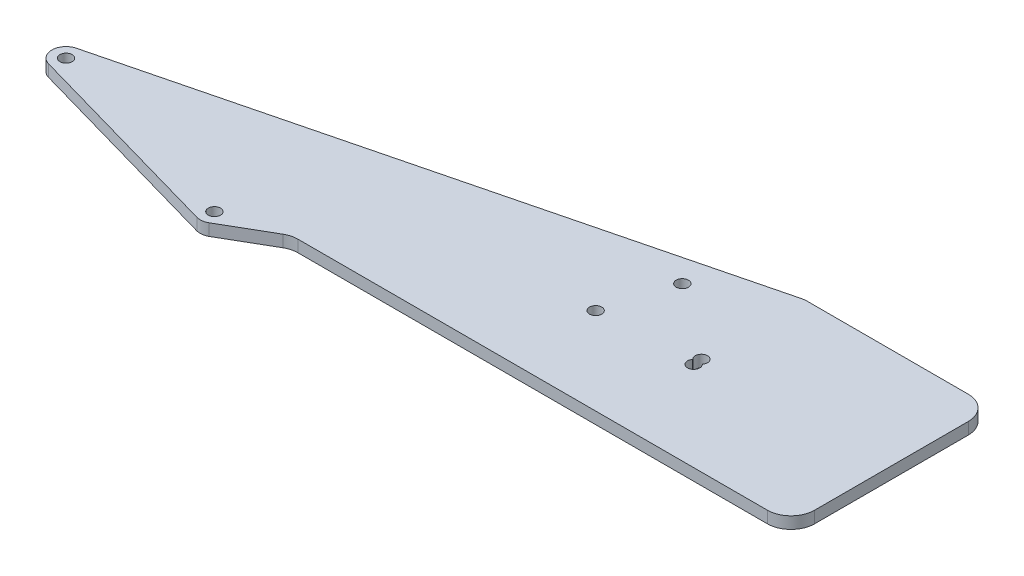
ISO-10303-21;
HEADER;
FILE_DESCRIPTION(('STEP AP214'),'2;1');
FILE_NAME('part.step','',(''),(''),'','','');
FILE_SCHEMA(('AUTOMOTIVE_DESIGN { 1 0 10303 214 1 1 1 1 }'));
ENDSEC;
DATA;
#1=APPLICATION_CONTEXT('core data for automotive mechanical design processes');
#2=APPLICATION_PROTOCOL_DEFINITION('international standard','automotive_design',2000,#1);
#3=PRODUCT_CONTEXT('',#1,'mechanical');
#4=PRODUCT('Part','Part','',(#3));
#5=PRODUCT_RELATED_PRODUCT_CATEGORY('part','',(#4));
#6=PRODUCT_DEFINITION_FORMATION('','',#4);
#7=PRODUCT_DEFINITION_CONTEXT('part definition',#1,'design');
#8=PRODUCT_DEFINITION('design','',#6,#7);
#9=PRODUCT_DEFINITION_SHAPE('','',#8);
#10=(LENGTH_UNIT() NAMED_UNIT(*) SI_UNIT(.MILLI.,.METRE.));
#11=(NAMED_UNIT(*) PLANE_ANGLE_UNIT() SI_UNIT($,.RADIAN.));
#12=(NAMED_UNIT(*) SI_UNIT($,.STERADIAN.) SOLID_ANGLE_UNIT());
#13=UNCERTAINTY_MEASURE_WITH_UNIT(LENGTH_MEASURE(1.E-05),#10,'distance_accuracy_value','');
#14=(GEOMETRIC_REPRESENTATION_CONTEXT(3) GLOBAL_UNCERTAINTY_ASSIGNED_CONTEXT((#13)) GLOBAL_UNIT_ASSIGNED_CONTEXT((#10,
#11,#12)) REPRESENTATION_CONTEXT('',''));
#15=CARTESIAN_POINT('',(0.,0.,0.));
#16=DIRECTION('',(0.,0.,1.));
#17=DIRECTION('',(1.,0.,0.));
#18=AXIS2_PLACEMENT_3D('',#15,#16,#17);
#19=CARTESIAN_POINT('',(170.96493724564,215.9,-60.2049776147186));
#20=DIRECTION('',(0.,-1.,0.));
#21=DIRECTION('',(0.,0.,-1.));
#22=AXIS2_PLACEMENT_3D('',#19,#20,#21);
#23=PLANE('',#22);
#24=DIRECTION('',(0.969793652529833,0.,-0.243926774899446));
#25=VECTOR('',#24,1.);
#26=CARTESIAN_POINT('',(57.8250270140459,215.9,-99.1719417743862));
#27=LINE('',#26,#25);
#28=CARTESIAN_POINT('',(57.8250270140459,215.9,-99.1719417743862));
#29=VERTEX_POINT('',#28);
#30=CARTESIAN_POINT('',(368.90591993318,215.9,-177.416379387129));
#31=VERTEX_POINT('',#30);
#32=EDGE_CURVE('E146',#29,#31,#27,.T.);
#33=ORIENTED_EDGE('',*,*,#32,.T.);
#34=CARTESIAN_POINT('',(372.003789974403,215.9,-165.1));
#35=DIRECTION('',(0.,-1.,0.));
#36=DIRECTION('',(0.,0.,-1.));
#37=AXIS2_PLACEMENT_3D('',#34,#35,#36);
#38=CIRCLE('',#37,12.7);
#39=CARTESIAN_POINT('',(372.003789974403,215.9,-177.8));
#40=VERTEX_POINT('',#39);
#41=EDGE_CURVE('E11',#31,#40,#38,.T.);
#42=ORIENTED_EDGE('',*,*,#41,.T.);
#43=DIRECTION('',(1.,0.,0.));
#44=VECTOR('',#43,1.);
#45=CARTESIAN_POINT('',(163.040808988288,215.9,-177.8));
#46=LINE('',#45,#44);
#47=CARTESIAN_POINT('',(458.47,215.9,-177.8));
#48=VERTEX_POINT('',#47);
#49=EDGE_CURVE('E198',#40,#48,#46,.T.);
#50=ORIENTED_EDGE('',*,*,#49,.T.);
#51=CARTESIAN_POINT('',(458.47,215.9,-165.1));
#52=DIRECTION('',(0.,-1.,0.));
#53=DIRECTION('',(0.,0.,-1.));
#54=AXIS2_PLACEMENT_3D('',#51,#52,#53);
#55=CIRCLE('',#54,12.7);
#56=CARTESIAN_POINT('',(471.17,215.9,-165.1));
#57=VERTEX_POINT('',#56);
#58=EDGE_CURVE('E248',#48,#57,#55,.T.);
#59=ORIENTED_EDGE('',*,*,#58,.T.);
#60=DIRECTION('',(0.,0.,1.));
#61=VECTOR('',#60,1.);
#62=CARTESIAN_POINT('',(471.17,215.9,-177.8));
#63=LINE('',#62,#61);
#64=CARTESIAN_POINT('',(471.17,215.9,-82.55));
#65=VERTEX_POINT('',#64);
#66=EDGE_CURVE('E200',#57,#65,#63,.T.);
#67=ORIENTED_EDGE('',*,*,#66,.T.);
#68=CARTESIAN_POINT('',(458.47,215.9,-82.55));
#69=DIRECTION('',(0.,-1.,0.));
#70=DIRECTION('',(0.,0.,-1.));
#71=AXIS2_PLACEMENT_3D('',#68,#69,#70);
#72=CIRCLE('',#71,12.7);
#73=CARTESIAN_POINT('',(458.47,215.9,-69.85));
#74=VERTEX_POINT('',#73);
#75=EDGE_CURVE('E250',#65,#74,#72,.T.);
#76=ORIENTED_EDGE('',*,*,#75,.T.);
#77=DIRECTION('',(-1.,0.,0.));
#78=VECTOR('',#77,1.);
#79=CARTESIAN_POINT('',(202.831083848814,215.9,-69.85));
#80=LINE('',#79,#78);
#81=CARTESIAN_POINT('',(206.242388341444,215.9,-69.85));
#82=VERTEX_POINT('',#81);
#83=EDGE_CURVE('E203',#74,#82,#80,.T.);
#84=ORIENTED_EDGE('',*,*,#83,.T.);
#85=CARTESIAN_POINT('',(206.242388341444,215.9,-57.15));
#86=DIRECTION('',(0.,-1.,0.));
#87=DIRECTION('',(0.,0.,-1.));
#88=AXIS2_PLACEMENT_3D('',#85,#86,#87);
#89=CIRCLE('',#88,12.7);
#90=CARTESIAN_POINT('',(199.878901935118,215.9,-68.1407252152215));
#91=VERTEX_POINT('',#90);
#92=EDGE_CURVE('E257',#82,#91,#89,.F.);
#93=ORIENTED_EDGE('',*,*,#92,.T.);
#94=DIRECTION('',(-0.865411434269409,0.,0.501061921757944));
#95=VECTOR('',#94,1.);
#96=CARTESIAN_POINT('',(174.783029089435,215.9,-53.6105424855857));
#97=LINE('',#96,#95);
#98=CARTESIAN_POINT('',(174.783029089435,215.9,-53.6105424855857));
#99=VERTEX_POINT('',#98);
#100=EDGE_CURVE('E206',#91,#99,#97,.T.);
#101=ORIENTED_EDGE('',*,*,#100,.T.);
#102=CARTESIAN_POINT('',(170.96493724564,215.9,-60.2049776147186));
#103=DIRECTION('',(0.,-1.,0.));
#104=DIRECTION('',(0.,0.,-1.));
#105=AXIS2_PLACEMENT_3D('',#102,#103,#104);
#106=CIRCLE('',#105,7.61999999999998);
#107=CARTESIAN_POINT('',(168.884811335963,215.9,-52.8743926312475));
#108=VERTEX_POINT('',#107);
#109=EDGE_CURVE('E208',#99,#108,#106,.T.);
#110=ORIENTED_EDGE('',*,*,#109,.T.);
#111=DIRECTION('',(-0.96201902670224,0.,-0.272982402844717));
#112=VECTOR('',#111,1.);
#113=CARTESIAN_POINT('',(57.603623129103,215.9,-84.4515291586379));
#114=LINE('',#113,#112);
#115=CARTESIAN_POINT('',(57.603623129103,215.9,-84.4515291586379));
#116=VERTEX_POINT('',#115);
#117=EDGE_CURVE('E149',#108,#116,#114,.T.);
#118=ORIENTED_EDGE('',*,*,#117,.T.);
#119=CARTESIAN_POINT('',(59.6837490387797,215.9,-91.7821141421089));
#120=DIRECTION('',(0.,-1.,0.));
#121=DIRECTION('',(0.,0.,1.));
#122=AXIS2_PLACEMENT_3D('',#119,#120,#121);
#123=CIRCLE('',#122,7.61999999999996);
#124=EDGE_CURVE('E143',#116,#29,#123,.T.);
#125=ORIENTED_EDGE('',*,*,#124,.T.);
#126=EDGE_LOOP('',(#33,#42,#50,#59,#67,#76,#84,#93,#101,#110,#118,#125));
#127=FACE_BOUND('',#126,.T.);
#128=CARTESIAN_POINT('',(370.810624172645,215.9,-117.899600818595));
#129=DIRECTION('',(0.,-1.,0.));
#130=DIRECTION('',(0.,0.,-1.));
#131=AXIS2_PLACEMENT_3D('',#128,#129,#130);
#132=CIRCLE('',#131,3.30200000000015);
#133=CARTESIAN_POINT('',(373.075128259812,215.9,-120.30277065013));
#134=VERTEX_POINT('',#133);
#135=CARTESIAN_POINT('',(368.235920217802,215.9,-119.966991334417));
#136=VERTEX_POINT('',#135);
#137=EDGE_CURVE('E176',#134,#136,#132,.T.);
#138=ORIENTED_EDGE('',*,*,#137,.F.);
#139=CARTESIAN_POINT('',(370.500424304969,215.9,-122.370161165953));
#140=DIRECTION('',(0.,-1.,0.));
#141=DIRECTION('',(0.,0.,-1.));
#142=AXIS2_PLACEMENT_3D('',#139,#140,#141);
#143=CIRCLE('',#142,3.30200000000015);
#144=EDGE_CURVE('E174',#136,#134,#143,.T.);
#145=ORIENTED_EDGE('',*,*,#144,.F.);
#146=EDGE_LOOP('',(#138,#145));
#147=FACE_BOUND('',#146,.T.);
#148=CARTESIAN_POINT('',(319.459191205803,215.9,-116.582508471068));
#149=DIRECTION('',(0.,-1.,0.));
#150=DIRECTION('',(0.,0.,-1.));
#151=AXIS2_PLACEMENT_3D('',#148,#149,#150);
#152=CIRCLE('',#151,3.3020000000001);
#153=CARTESIAN_POINT('',(319.459191205803,215.9,-119.884508471068));
#154=VERTEX_POINT('',#153);
#155=EDGE_CURVE('E171',#154,#154,#152,.T.);
#156=ORIENTED_EDGE('',*,*,#155,.F.);
#157=EDGE_LOOP('',(#156));
#158=FACE_BOUND('',#157,.T.);
#159=CARTESIAN_POINT('',(59.6837490387797,215.9,-91.7821141421089));
#160=DIRECTION('',(0.,-1.,0.));
#161=DIRECTION('',(0.,0.,-1.));
#162=AXIS2_PLACEMENT_3D('',#159,#160,#161);
#163=CIRCLE('',#162,3.30200000000001);
#164=CARTESIAN_POINT('',(59.6837490387797,215.9,-95.0841141421089));
#165=VERTEX_POINT('',#164);
#166=EDGE_CURVE('E186',#165,#165,#163,.T.);
#167=ORIENTED_EDGE('',*,*,#166,.F.);
#168=EDGE_LOOP('',(#167));
#169=FACE_BOUND('',#168,.T.);
#170=CARTESIAN_POINT('',(330.2,215.9,-152.4));
#171=DIRECTION('',(0.,-1.,0.));
#172=DIRECTION('',(0.,0.,-1.));
#173=AXIS2_PLACEMENT_3D('',#170,#171,#172);
#174=CIRCLE('',#173,3.30200000000004);
#175=CARTESIAN_POINT('',(330.2,215.9,-155.702));
#176=VERTEX_POINT('',#175);
#177=EDGE_CURVE('E192',#176,#176,#174,.T.);
#178=ORIENTED_EDGE('',*,*,#177,.F.);
#179=EDGE_LOOP('',(#178));
#180=FACE_BOUND('',#179,.T.);
#181=CARTESIAN_POINT('',(170.96493724564,215.9,-60.2049776147186));
#182=DIRECTION('',(0.,-1.,0.));
#183=DIRECTION('',(0.,0.,-1.));
#184=AXIS2_PLACEMENT_3D('',#181,#182,#183);
#185=CIRCLE('',#184,3.30200000000001);
#186=CARTESIAN_POINT('',(170.96493724564,215.9,-63.5069776147186));
#187=VERTEX_POINT('',#186);
#188=EDGE_CURVE('E180',#187,#187,#185,.T.);
#189=ORIENTED_EDGE('',*,*,#188,.F.);
#190=EDGE_LOOP('',(#189));
#191=FACE_BOUND('',#190,.T.);
#192=ADVANCED_FACE('F43',(#127,#147,#158,#169,#180,#191),#23,.T.);
#193=CARTESIAN_POINT('',(170.96493724564,222.25,-60.2049776147186));
#194=DIRECTION('',(0.,-1.,0.));
#195=DIRECTION('',(0.,0.,-1.));
#196=AXIS2_PLACEMENT_3D('',#193,#194,#195);
#197=PLANE('',#196);
#198=CARTESIAN_POINT('',(370.500424304969,222.25,-122.370161165953));
#199=DIRECTION('',(0.,-1.,0.));
#200=DIRECTION('',(0.,0.,-1.));
#201=AXIS2_PLACEMENT_3D('',#198,#199,#200);
#202=CIRCLE('',#201,3.30200000000015);
#203=CARTESIAN_POINT('',(368.235920217802,222.25,-119.966991334417));
#204=VERTEX_POINT('',#203);
#205=CARTESIAN_POINT('',(373.075128259812,222.25,-120.30277065013));
#206=VERTEX_POINT('',#205);
#207=EDGE_CURVE('E259',#204,#206,#202,.T.);
#208=ORIENTED_EDGE('',*,*,#207,.T.);
#209=CARTESIAN_POINT('',(370.810624172645,222.25,-117.899600818595));
#210=DIRECTION('',(0.,-1.,0.));
#211=DIRECTION('',(0.,0.,-1.));
#212=AXIS2_PLACEMENT_3D('',#209,#210,#211);
#213=CIRCLE('',#212,3.30200000000015);
#214=EDGE_CURVE('E264',#206,#204,#213,.T.);
#215=ORIENTED_EDGE('',*,*,#214,.T.);
#216=EDGE_LOOP('',(#208,#215));
#217=FACE_BOUND('',#216,.T.);
#218=CARTESIAN_POINT('',(319.459191205803,222.25,-116.582508471068));
#219=DIRECTION('',(0.,-1.,0.));
#220=DIRECTION('',(0.,0.,-1.));
#221=AXIS2_PLACEMENT_3D('',#218,#219,#220);
#222=CIRCLE('',#221,3.3020000000001);
#223=CARTESIAN_POINT('',(319.459191205803,222.25,-119.884508471068));
#224=VERTEX_POINT('',#223);
#225=EDGE_CURVE('E168',#224,#224,#222,.T.);
#226=ORIENTED_EDGE('',*,*,#225,.T.);
#227=EDGE_LOOP('',(#226));
#228=FACE_BOUND('',#227,.T.);
#229=DIRECTION('',(1.,0.,0.));
#230=VECTOR('',#229,1.);
#231=CARTESIAN_POINT('',(163.040808988288,222.25,-177.8));
#232=LINE('',#231,#230);
#233=CARTESIAN_POINT('',(372.003789974403,222.25,-177.8));
#234=VERTEX_POINT('',#233);
#235=CARTESIAN_POINT('',(458.47,222.25,-177.8));
#236=VERTEX_POINT('',#235);
#237=EDGE_CURVE('E195',#234,#236,#232,.T.);
#238=ORIENTED_EDGE('',*,*,#237,.F.);
#239=CARTESIAN_POINT('',(372.003789974403,222.25,-165.1));
#240=DIRECTION('',(0.,-1.,0.));
#241=DIRECTION('',(0.,0.,-1.));
#242=AXIS2_PLACEMENT_3D('',#239,#240,#241);
#243=CIRCLE('',#242,12.7);
#244=CARTESIAN_POINT('',(368.90591993318,222.25,-177.416379387129));
#245=VERTEX_POINT('',#244);
#246=EDGE_CURVE('E65',#234,#245,#243,.F.);
#247=ORIENTED_EDGE('',*,*,#246,.T.);
#248=DIRECTION('',(0.969793652529833,0.,-0.243926774899446));
#249=VECTOR('',#248,1.);
#250=CARTESIAN_POINT('',(57.8250270140459,222.25,-99.1719417743862));
#251=LINE('',#250,#249);
#252=CARTESIAN_POINT('',(57.8250270140459,222.25,-99.1719417743862));
#253=VERTEX_POINT('',#252);
#254=EDGE_CURVE('E160',#253,#245,#251,.T.);
#255=ORIENTED_EDGE('',*,*,#254,.F.);
#256=CARTESIAN_POINT('',(59.6837490387797,222.25,-91.7821141421089));
#257=DIRECTION('',(0.,-1.,0.));
#258=DIRECTION('',(0.,0.,1.));
#259=AXIS2_PLACEMENT_3D('',#256,#257,#258);
#260=CIRCLE('',#259,7.61999999999996);
#261=CARTESIAN_POINT('',(57.603623129103,222.25,-84.4515291586379));
#262=VERTEX_POINT('',#261);
#263=EDGE_CURVE('E159',#262,#253,#260,.T.);
#264=ORIENTED_EDGE('',*,*,#263,.F.);
#265=DIRECTION('',(-0.96201902670224,0.,-0.272982402844717));
#266=VECTOR('',#265,1.);
#267=CARTESIAN_POINT('',(57.603623129103,222.25,-84.4515291586379));
#268=LINE('',#267,#266);
#269=CARTESIAN_POINT('',(168.884811335963,222.25,-52.8743926312475));
#270=VERTEX_POINT('',#269);
#271=EDGE_CURVE('E221',#270,#262,#268,.T.);
#272=ORIENTED_EDGE('',*,*,#271,.F.);
#273=CARTESIAN_POINT('',(170.96493724564,222.25,-60.2049776147186));
#274=DIRECTION('',(0.,-1.,0.));
#275=DIRECTION('',(0.,0.,-1.));
#276=AXIS2_PLACEMENT_3D('',#273,#274,#275);
#277=CIRCLE('',#276,7.61999999999998);
#278=CARTESIAN_POINT('',(174.783029089435,222.25,-53.6105424855857));
#279=VERTEX_POINT('',#278);
#280=EDGE_CURVE('E219',#279,#270,#277,.T.);
#281=ORIENTED_EDGE('',*,*,#280,.F.);
#282=DIRECTION('',(-0.865411434269409,0.,0.501061921757944));
#283=VECTOR('',#282,1.);
#284=CARTESIAN_POINT('',(174.783029089435,222.25,-53.6105424855857));
#285=LINE('',#284,#283);
#286=CARTESIAN_POINT('',(199.878901935118,222.25,-68.1407252152215));
#287=VERTEX_POINT('',#286);
#288=EDGE_CURVE('E217',#287,#279,#285,.T.);
#289=ORIENTED_EDGE('',*,*,#288,.F.);
#290=CARTESIAN_POINT('',(206.242388341444,222.25,-57.15));
#291=DIRECTION('',(0.,-1.,0.));
#292=DIRECTION('',(0.,0.,-1.));
#293=AXIS2_PLACEMENT_3D('',#290,#291,#292);
#294=CIRCLE('',#293,12.7);
#295=CARTESIAN_POINT('',(206.242388341444,222.25,-69.85));
#296=VERTEX_POINT('',#295);
#297=EDGE_CURVE('E255',#287,#296,#294,.T.);
#298=ORIENTED_EDGE('',*,*,#297,.T.);
#299=DIRECTION('',(-1.,0.,0.));
#300=VECTOR('',#299,1.);
#301=CARTESIAN_POINT('',(202.831083848814,222.25,-69.85));
#302=LINE('',#301,#300);
#303=CARTESIAN_POINT('',(458.47,222.25,-69.85));
#304=VERTEX_POINT('',#303);
#305=EDGE_CURVE('E214',#304,#296,#302,.T.);
#306=ORIENTED_EDGE('',*,*,#305,.F.);
#307=CARTESIAN_POINT('',(458.47,222.25,-82.55));
#308=DIRECTION('',(0.,-1.,0.));
#309=DIRECTION('',(0.,0.,-1.));
#310=AXIS2_PLACEMENT_3D('',#307,#308,#309);
#311=CIRCLE('',#310,12.7);
#312=CARTESIAN_POINT('',(471.17,222.25,-82.55));
#313=VERTEX_POINT('',#312);
#314=EDGE_CURVE('E241',#304,#313,#311,.F.);
#315=ORIENTED_EDGE('',*,*,#314,.T.);
#316=DIRECTION('',(0.,0.,1.));
#317=VECTOR('',#316,1.);
#318=CARTESIAN_POINT('',(471.17,222.25,-177.8));
#319=LINE('',#318,#317);
#320=CARTESIAN_POINT('',(471.17,222.25,-165.1));
#321=VERTEX_POINT('',#320);
#322=EDGE_CURVE('E211',#321,#313,#319,.T.);
#323=ORIENTED_EDGE('',*,*,#322,.F.);
#324=CARTESIAN_POINT('',(458.47,222.25,-165.1));
#325=DIRECTION('',(0.,-1.,0.));
#326=DIRECTION('',(0.,0.,-1.));
#327=AXIS2_PLACEMENT_3D('',#324,#325,#326);
#328=CIRCLE('',#327,12.7);
#329=EDGE_CURVE('E238',#321,#236,#328,.F.);
#330=ORIENTED_EDGE('',*,*,#329,.T.);
#331=EDGE_LOOP('',(#238,#247,#255,#264,#272,#281,#289,#298,#306,#315,#323,#330));
#332=FACE_BOUND('',#331,.T.);
#333=CARTESIAN_POINT('',(330.2,222.25,-152.4));
#334=DIRECTION('',(0.,-1.,0.));
#335=DIRECTION('',(0.,0.,-1.));
#336=AXIS2_PLACEMENT_3D('',#333,#334,#335);
#337=CIRCLE('',#336,3.30200000000004);
#338=CARTESIAN_POINT('',(330.2,222.25,-155.702));
#339=VERTEX_POINT('',#338);
#340=EDGE_CURVE('E189',#339,#339,#337,.T.);
#341=ORIENTED_EDGE('',*,*,#340,.T.);
#342=EDGE_LOOP('',(#341));
#343=FACE_BOUND('',#342,.T.);
#344=CARTESIAN_POINT('',(59.6837490387797,222.25,-91.7821141421089));
#345=DIRECTION('',(0.,-1.,0.));
#346=DIRECTION('',(0.,0.,-1.));
#347=AXIS2_PLACEMENT_3D('',#344,#345,#346);
#348=CIRCLE('',#347,3.30200000000001);
#349=CARTESIAN_POINT('',(59.6837490387797,222.25,-95.0841141421089));
#350=VERTEX_POINT('',#349);
#351=EDGE_CURVE('E183',#350,#350,#348,.T.);
#352=ORIENTED_EDGE('',*,*,#351,.T.);
#353=EDGE_LOOP('',(#352));
#354=FACE_BOUND('',#353,.T.);
#355=CARTESIAN_POINT('',(170.96493724564,222.25,-60.2049776147186));
#356=DIRECTION('',(0.,-1.,0.));
#357=DIRECTION('',(0.,0.,-1.));
#358=AXIS2_PLACEMENT_3D('',#355,#356,#357);
#359=CIRCLE('',#358,3.30200000000001);
#360=CARTESIAN_POINT('',(170.96493724564,222.25,-63.5069776147186));
#361=VERTEX_POINT('',#360);
#362=EDGE_CURVE('E179',#361,#361,#359,.T.);
#363=ORIENTED_EDGE('',*,*,#362,.T.);
#364=EDGE_LOOP('',(#363));
#365=FACE_BOUND('',#364,.T.);
#366=ADVANCED_FACE('F278',(#217,#228,#332,#343,#354,#365),#197,.F.);
#367=CARTESIAN_POINT('',(163.040808988288,215.9,-177.8));
#368=DIRECTION('',(0.,0.,1.));
#369=DIRECTION('',(1.,0.,0.));
#370=AXIS2_PLACEMENT_3D('',#367,#368,#369);
#371=PLANE('',#370);
#372=ORIENTED_EDGE('',*,*,#49,.F.);
#373=DIRECTION('',(0.,1.,0.));
#374=VECTOR('',#373,1.);
#375=CARTESIAN_POINT('',(372.003789974403,215.9,-177.8));
#376=LINE('',#375,#374);
#377=EDGE_CURVE('E267',#40,#234,#376,.T.);
#378=ORIENTED_EDGE('',*,*,#377,.T.);
#379=ORIENTED_EDGE('',*,*,#237,.T.);
#380=DIRECTION('',(0.,1.,0.));
#381=VECTOR('',#380,1.);
#382=CARTESIAN_POINT('',(458.47,215.9,-177.8));
#383=LINE('',#382,#381);
#384=EDGE_CURVE('E252',#236,#48,#383,.F.);
#385=ORIENTED_EDGE('',*,*,#384,.T.);
#386=EDGE_LOOP('',(#372,#378,#379,#385));
#387=FACE_BOUND('',#386,.T.);
#388=ADVANCED_FACE('F276',(#387),#371,.F.);
#389=CARTESIAN_POINT('',(471.17,215.9,-177.8));
#390=DIRECTION('',(-1.,0.,0.));
#391=DIRECTION('',(0.,0.,1.));
#392=AXIS2_PLACEMENT_3D('',#389,#390,#391);
#393=PLANE('',#392);
#394=ORIENTED_EDGE('',*,*,#322,.T.);
#395=DIRECTION('',(0.,1.,0.));
#396=VECTOR('',#395,1.);
#397=CARTESIAN_POINT('',(471.17,215.9,-82.55));
#398=LINE('',#397,#396);
#399=EDGE_CURVE('E246',#313,#65,#398,.F.);
#400=ORIENTED_EDGE('',*,*,#399,.T.);
#401=ORIENTED_EDGE('',*,*,#66,.F.);
#402=DIRECTION('',(0.,1.,0.));
#403=VECTOR('',#402,1.);
#404=CARTESIAN_POINT('',(471.17,215.9,-165.1));
#405=LINE('',#404,#403);
#406=EDGE_CURVE('E243',#57,#321,#405,.T.);
#407=ORIENTED_EDGE('',*,*,#406,.T.);
#408=EDGE_LOOP('',(#394,#400,#401,#407));
#409=FACE_BOUND('',#408,.T.);
#410=ADVANCED_FACE('F289',(#409),#393,.F.);
#411=CARTESIAN_POINT('',(202.831083848814,215.9,-69.85));
#412=DIRECTION('',(0.,0.,-1.));
#413=DIRECTION('',(-1.,0.,0.));
#414=AXIS2_PLACEMENT_3D('',#411,#412,#413);
#415=PLANE('',#414);
#416=ORIENTED_EDGE('',*,*,#305,.T.);
#417=DIRECTION('',(0.,1.,0.));
#418=VECTOR('',#417,1.);
#419=CARTESIAN_POINT('',(206.242388341444,215.9,-69.85));
#420=LINE('',#419,#418);
#421=EDGE_CURVE('E236',#296,#82,#420,.F.);
#422=ORIENTED_EDGE('',*,*,#421,.T.);
#423=ORIENTED_EDGE('',*,*,#83,.F.);
#424=DIRECTION('',(0.,1.,0.));
#425=VECTOR('',#424,1.);
#426=CARTESIAN_POINT('',(458.47,215.9,-69.85));
#427=LINE('',#426,#425);
#428=EDGE_CURVE('E233',#74,#304,#427,.T.);
#429=ORIENTED_EDGE('',*,*,#428,.T.);
#430=EDGE_LOOP('',(#416,#422,#423,#429));
#431=FACE_BOUND('',#430,.T.);
#432=ADVANCED_FACE('F297',(#431),#415,.F.);
#433=CARTESIAN_POINT('',(174.783029089435,215.9,-53.6105424855857));
#434=DIRECTION('',(-0.501061921757944,0.,-0.865411434269409));
#435=DIRECTION('',(-0.865411434269409,0.,0.501061921757944));
#436=AXIS2_PLACEMENT_3D('',#433,#434,#435);
#437=PLANE('',#436);
#438=ORIENTED_EDGE('',*,*,#100,.F.);
#439=DIRECTION('',(0.,1.,0.));
#440=VECTOR('',#439,1.);
#441=CARTESIAN_POINT('',(199.878901935118,222.25,-68.1407252152215));
#442=LINE('',#441,#440);
#443=EDGE_CURVE('E230',#91,#287,#442,.T.);
#444=ORIENTED_EDGE('',*,*,#443,.T.);
#445=ORIENTED_EDGE('',*,*,#288,.T.);
#446=DIRECTION('',(0.,1.,0.));
#447=VECTOR('',#446,1.);
#448=CARTESIAN_POINT('',(174.783029089435,215.9,-53.6105424855857));
#449=LINE('',#448,#447);
#450=EDGE_CURVE('E227',#99,#279,#449,.T.);
#451=ORIENTED_EDGE('',*,*,#450,.F.);
#452=EDGE_LOOP('',(#438,#444,#445,#451));
#453=FACE_BOUND('',#452,.T.);
#454=ADVANCED_FACE('F306',(#453),#437,.F.);
#455=CARTESIAN_POINT('',(170.96493724564,215.9,-60.2049776147186));
#456=DIRECTION('',(0.,1.,0.));
#457=DIRECTION('',(0.,0.,1.));
#458=AXIS2_PLACEMENT_3D('',#455,#456,#457);
#459=CYLINDRICAL_SURFACE('',#458,7.61999999999998);
#460=ORIENTED_EDGE('',*,*,#280,.T.);
#461=DIRECTION('',(0.,1.,0.));
#462=VECTOR('',#461,1.);
#463=CARTESIAN_POINT('',(168.884811335963,215.9,-52.8743926312475));
#464=LINE('',#463,#462);
#465=EDGE_CURVE('E224',#108,#270,#464,.T.);
#466=ORIENTED_EDGE('',*,*,#465,.F.);
#467=ORIENTED_EDGE('',*,*,#109,.F.);
#468=ORIENTED_EDGE('',*,*,#450,.T.);
#469=EDGE_LOOP('',(#460,#466,#467,#468));
#470=FACE_BOUND('',#469,.T.);
#471=ADVANCED_FACE('F312',(#470),#459,.T.);
#472=CARTESIAN_POINT('',(57.603623129103,215.9,-84.4515291586379));
#473=DIRECTION('',(0.272982402844717,0.,-0.96201902670224));
#474=DIRECTION('',(-0.96201902670224,0.,-0.272982402844717));
#475=AXIS2_PLACEMENT_3D('',#472,#473,#474);
#476=PLANE('',#475);
#477=ORIENTED_EDGE('',*,*,#271,.T.);
#478=DIRECTION('',(0.,1.,0.));
#479=VECTOR('',#478,1.);
#480=CARTESIAN_POINT('',(57.603623129103,215.9,-84.4515291586379));
#481=LINE('',#480,#479);
#482=EDGE_CURVE('E153',#116,#262,#481,.T.);
#483=ORIENTED_EDGE('',*,*,#482,.F.);
#484=ORIENTED_EDGE('',*,*,#117,.F.);
#485=ORIENTED_EDGE('',*,*,#465,.T.);
#486=EDGE_LOOP('',(#477,#483,#484,#485));
#487=FACE_BOUND('',#486,.T.);
#488=ADVANCED_FACE('F315',(#487),#476,.F.);
#489=CARTESIAN_POINT('',(59.6837490387797,215.9,-91.7821141421089));
#490=DIRECTION('',(0.,1.,0.));
#491=DIRECTION('',(0.,0.,1.));
#492=AXIS2_PLACEMENT_3D('',#489,#490,#491);
#493=CYLINDRICAL_SURFACE('',#492,7.61999999999996);
#494=ORIENTED_EDGE('',*,*,#263,.T.);
#495=DIRECTION('',(0.,1.,0.));
#496=VECTOR('',#495,1.);
#497=CARTESIAN_POINT('',(57.8250270140459,215.9,-99.1719417743862));
#498=LINE('',#497,#496);
#499=EDGE_CURVE('E156',#29,#253,#498,.T.);
#500=ORIENTED_EDGE('',*,*,#499,.F.);
#501=ORIENTED_EDGE('',*,*,#124,.F.);
#502=ORIENTED_EDGE('',*,*,#482,.T.);
#503=EDGE_LOOP('',(#494,#500,#501,#502));
#504=FACE_BOUND('',#503,.T.);
#505=ADVANCED_FACE('F157',(#504),#493,.T.);
#506=CARTESIAN_POINT('',(330.2,215.9,-152.4));
#507=DIRECTION('',(0.,1.,0.));
#508=DIRECTION('',(0.,0.,1.));
#509=AXIS2_PLACEMENT_3D('',#506,#507,#508);
#510=CYLINDRICAL_SURFACE('',#509,3.30200000000004);
#511=ORIENTED_EDGE('',*,*,#177,.T.);
#512=EDGE_LOOP('',(#511));
#513=FACE_BOUND('',#512,.T.);
#514=ORIENTED_EDGE('',*,*,#340,.F.);
#515=EDGE_LOOP('',(#514));
#516=FACE_BOUND('',#515,.T.);
#517=ADVANCED_FACE('F331',(#513,#516),#510,.F.);
#518=CARTESIAN_POINT('',(59.6837490387797,215.9,-91.7821141421089));
#519=DIRECTION('',(0.,1.,0.));
#520=DIRECTION('',(0.,0.,1.));
#521=AXIS2_PLACEMENT_3D('',#518,#519,#520);
#522=CYLINDRICAL_SURFACE('',#521,3.30200000000001);
#523=ORIENTED_EDGE('',*,*,#166,.T.);
#524=EDGE_LOOP('',(#523));
#525=FACE_BOUND('',#524,.T.);
#526=ORIENTED_EDGE('',*,*,#351,.F.);
#527=EDGE_LOOP('',(#526));
#528=FACE_BOUND('',#527,.T.);
#529=ADVANCED_FACE('F370',(#525,#528),#522,.F.);
#530=CARTESIAN_POINT('',(170.96493724564,215.9,-60.2049776147186));
#531=DIRECTION('',(0.,1.,0.));
#532=DIRECTION('',(0.,0.,1.));
#533=AXIS2_PLACEMENT_3D('',#530,#531,#532);
#534=CYLINDRICAL_SURFACE('',#533,3.30200000000001);
#535=ORIENTED_EDGE('',*,*,#188,.T.);
#536=EDGE_LOOP('',(#535));
#537=FACE_BOUND('',#536,.T.);
#538=ORIENTED_EDGE('',*,*,#362,.F.);
#539=EDGE_LOOP('',(#538));
#540=FACE_BOUND('',#539,.T.);
#541=ADVANCED_FACE('F349',(#537,#540),#534,.F.);
#542=CARTESIAN_POINT('',(206.242388341444,215.9,-57.15));
#543=DIRECTION('',(0.,-1.,0.));
#544=DIRECTION('',(0.,0.,-1.));
#545=AXIS2_PLACEMENT_3D('',#542,#543,#544);
#546=CYLINDRICAL_SURFACE('',#545,12.7);
#547=ORIENTED_EDGE('',*,*,#92,.F.);
#548=ORIENTED_EDGE('',*,*,#421,.F.);
#549=ORIENTED_EDGE('',*,*,#297,.F.);
#550=ORIENTED_EDGE('',*,*,#443,.F.);
#551=EDGE_LOOP('',(#547,#548,#549,#550));
#552=FACE_BOUND('',#551,.T.);
#553=ADVANCED_FACE('F301',(#552),#546,.F.);
#554=CARTESIAN_POINT('',(458.47,215.9,-82.55));
#555=DIRECTION('',(0.,1.,0.));
#556=DIRECTION('',(0.,0.,1.));
#557=AXIS2_PLACEMENT_3D('',#554,#555,#556);
#558=CYLINDRICAL_SURFACE('',#557,12.7);
#559=ORIENTED_EDGE('',*,*,#75,.F.);
#560=ORIENTED_EDGE('',*,*,#399,.F.);
#561=ORIENTED_EDGE('',*,*,#314,.F.);
#562=ORIENTED_EDGE('',*,*,#428,.F.);
#563=EDGE_LOOP('',(#559,#560,#561,#562));
#564=FACE_BOUND('',#563,.T.);
#565=ADVANCED_FACE('F292',(#564),#558,.T.);
#566=CARTESIAN_POINT('',(458.47,215.9,-165.1));
#567=DIRECTION('',(0.,1.,0.));
#568=DIRECTION('',(0.,0.,1.));
#569=AXIS2_PLACEMENT_3D('',#566,#567,#568);
#570=CYLINDRICAL_SURFACE('',#569,12.7);
#571=ORIENTED_EDGE('',*,*,#58,.F.);
#572=ORIENTED_EDGE('',*,*,#384,.F.);
#573=ORIENTED_EDGE('',*,*,#329,.F.);
#574=ORIENTED_EDGE('',*,*,#406,.F.);
#575=EDGE_LOOP('',(#571,#572,#573,#574));
#576=FACE_BOUND('',#575,.T.);
#577=ADVANCED_FACE('F285',(#576),#570,.T.);
#578=CARTESIAN_POINT('',(319.459191205803,666.75,-116.582508471068));
#579=DIRECTION('',(0.,-1.,0.));
#580=DIRECTION('',(0.,0.,-1.));
#581=AXIS2_PLACEMENT_3D('',#578,#579,#580);
#582=CYLINDRICAL_SURFACE('',#581,3.3020000000001);
#583=ORIENTED_EDGE('',*,*,#155,.T.);
#584=EDGE_LOOP('',(#583));
#585=FACE_BOUND('',#584,.T.);
#586=ORIENTED_EDGE('',*,*,#225,.F.);
#587=EDGE_LOOP('',(#586));
#588=FACE_BOUND('',#587,.T.);
#589=ADVANCED_FACE('F352',(#585,#588),#582,.F.);
#590=CARTESIAN_POINT('',(370.810624172645,666.75,-117.899600818595));
#591=DIRECTION('',(0.,-1.,0.));
#592=DIRECTION('',(0.,0.,-1.));
#593=AXIS2_PLACEMENT_3D('',#590,#591,#592);
#594=CYLINDRICAL_SURFACE('',#593,3.30200000000015);
#595=ORIENTED_EDGE('',*,*,#137,.T.);
#596=DIRECTION('',(0.,-1.,0.));
#597=VECTOR('',#596,1.);
#598=CARTESIAN_POINT('',(368.235920217802,666.75,-119.966991334417));
#599=LINE('',#598,#597);
#600=EDGE_CURVE('E169',#204,#136,#599,.T.);
#601=ORIENTED_EDGE('',*,*,#600,.F.);
#602=ORIENTED_EDGE('',*,*,#214,.F.);
#603=DIRECTION('',(0.,-1.,0.));
#604=VECTOR('',#603,1.);
#605=CARTESIAN_POINT('',(373.075128259812,666.75,-120.30277065013));
#606=LINE('',#605,#604);
#607=EDGE_CURVE('E165',#206,#134,#606,.T.);
#608=ORIENTED_EDGE('',*,*,#607,.T.);
#609=EDGE_LOOP('',(#595,#601,#602,#608));
#610=FACE_BOUND('',#609,.T.);
#611=ADVANCED_FACE('F357',(#610),#594,.F.);
#612=CARTESIAN_POINT('',(370.500424304969,666.75,-122.370161165953));
#613=DIRECTION('',(0.,-1.,0.));
#614=DIRECTION('',(0.,0.,-1.));
#615=AXIS2_PLACEMENT_3D('',#612,#613,#614);
#616=CYLINDRICAL_SURFACE('',#615,3.30200000000015);
#617=ORIENTED_EDGE('',*,*,#144,.T.);
#618=ORIENTED_EDGE('',*,*,#607,.F.);
#619=ORIENTED_EDGE('',*,*,#207,.F.);
#620=ORIENTED_EDGE('',*,*,#600,.T.);
#621=EDGE_LOOP('',(#617,#618,#619,#620));
#622=FACE_BOUND('',#621,.T.);
#623=ADVANCED_FACE('F320',(#622),#616,.F.);
#624=CARTESIAN_POINT('',(57.8250270140459,215.9,-99.1719417743862));
#625=DIRECTION('',(0.243926774899446,0.,0.969793652529833));
#626=DIRECTION('',(0.969793652529833,0.,-0.243926774899446));
#627=AXIS2_PLACEMENT_3D('',#624,#625,#626);
#628=PLANE('',#627);
#629=ORIENTED_EDGE('',*,*,#254,.T.);
#630=DIRECTION('',(0.,1.,0.));
#631=VECTOR('',#630,1.);
#632=CARTESIAN_POINT('',(368.90591993318,215.9,-177.416379387129));
#633=LINE('',#632,#631);
#634=EDGE_CURVE('E51',#245,#31,#633,.F.);
#635=ORIENTED_EDGE('',*,*,#634,.T.);
#636=ORIENTED_EDGE('',*,*,#32,.F.);
#637=ORIENTED_EDGE('',*,*,#499,.T.);
#638=EDGE_LOOP('',(#629,#635,#636,#637));
#639=FACE_BOUND('',#638,.T.);
#640=ADVANCED_FACE('F162',(#639),#628,.F.);
#641=CARTESIAN_POINT('',(372.003789974403,215.9,-165.1));
#642=DIRECTION('',(0.,1.,0.));
#643=DIRECTION('',(0.,0.,1.));
#644=AXIS2_PLACEMENT_3D('',#641,#642,#643);
#645=CYLINDRICAL_SURFACE('',#644,12.7);
#646=ORIENTED_EDGE('',*,*,#41,.F.);
#647=ORIENTED_EDGE('',*,*,#634,.F.);
#648=ORIENTED_EDGE('',*,*,#246,.F.);
#649=ORIENTED_EDGE('',*,*,#377,.F.);
#650=EDGE_LOOP('',(#646,#647,#648,#649));
#651=FACE_BOUND('',#650,.T.);
#652=ADVANCED_FACE('F45',(#651),#645,.T.);
#653=CLOSED_SHELL('',(#192,#366,#388,#410,#432,#454,#471,#488,#505,#517,#529,#541,#553,#565,
#577,#589,#611,#623,#640,#652));
#654=MANIFOLD_SOLID_BREP('B2',#653);
#655=ADVANCED_BREP_SHAPE_REPRESENTATION('',(#18,#654),#14);
#656=SHAPE_DEFINITION_REPRESENTATION(#9,#655);
ENDSEC;
END-ISO-10303-21;
